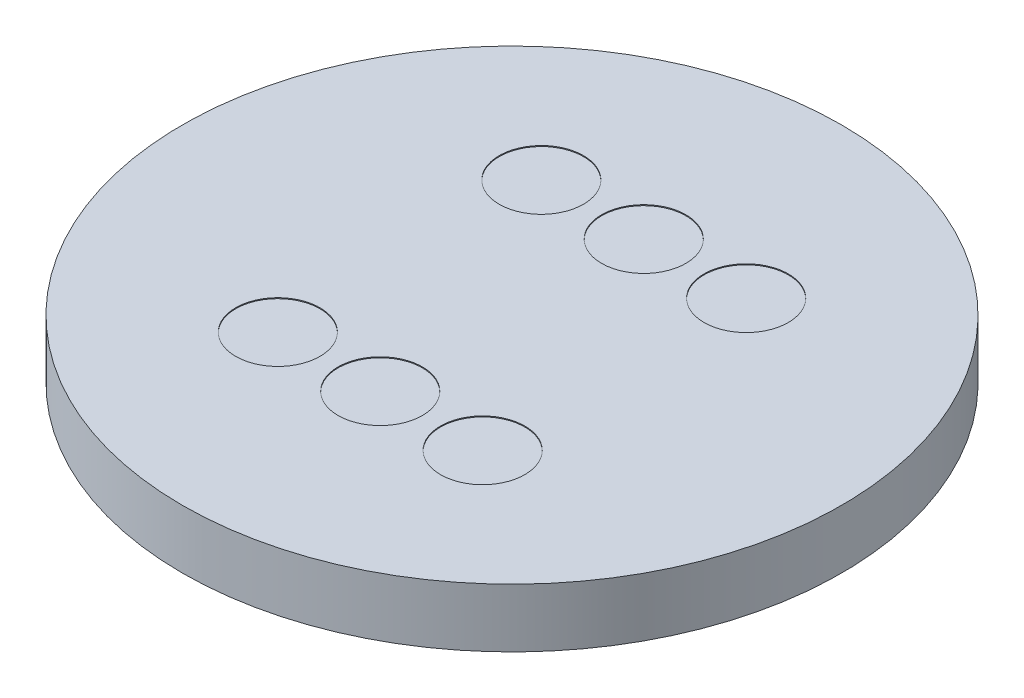
ISO-10303-21;
HEADER;
FILE_DESCRIPTION(('STEP AP214'),'2;1');
FILE_NAME('part.step','',(''),(''),'','','');
FILE_SCHEMA(('AUTOMOTIVE_DESIGN { 1 0 10303 214 1 1 1 1 }'));
ENDSEC;
DATA;
#1=APPLICATION_CONTEXT('core data for automotive mechanical design processes');
#2=APPLICATION_PROTOCOL_DEFINITION('international standard','automotive_design',2000,#1);
#3=PRODUCT_CONTEXT('',#1,'mechanical');
#4=PRODUCT('Part','Part','',(#3));
#5=PRODUCT_RELATED_PRODUCT_CATEGORY('part','',(#4));
#6=PRODUCT_DEFINITION_FORMATION('','',#4);
#7=PRODUCT_DEFINITION_CONTEXT('part definition',#1,'design');
#8=PRODUCT_DEFINITION('design','',#6,#7);
#9=PRODUCT_DEFINITION_SHAPE('','',#8);
#10=(LENGTH_UNIT() NAMED_UNIT(*) SI_UNIT(.MILLI.,.METRE.));
#11=(NAMED_UNIT(*) PLANE_ANGLE_UNIT() SI_UNIT($,.RADIAN.));
#12=(NAMED_UNIT(*) SI_UNIT($,.STERADIAN.) SOLID_ANGLE_UNIT());
#13=UNCERTAINTY_MEASURE_WITH_UNIT(LENGTH_MEASURE(1.E-05),#10,'distance_accuracy_value','');
#14=(GEOMETRIC_REPRESENTATION_CONTEXT(3) GLOBAL_UNCERTAINTY_ASSIGNED_CONTEXT((#13)) GLOBAL_UNIT_ASSIGNED_CONTEXT((#10,
#11,#12)) REPRESENTATION_CONTEXT('',''));
#15=CARTESIAN_POINT('',(0.,0.,0.));
#16=DIRECTION('',(0.,0.,1.));
#17=DIRECTION('',(1.,0.,0.));
#18=AXIS2_PLACEMENT_3D('',#15,#16,#17);
#19=CARTESIAN_POINT('',(0.,1.651,0.));
#20=DIRECTION('',(0.,-1.,0.));
#21=DIRECTION('',(0.,0.,-1.));
#22=AXIS2_PLACEMENT_3D('',#19,#20,#21);
#23=CYLINDRICAL_SURFACE('',#22,9.271);
#24=CARTESIAN_POINT('',(0.,1.651,0.));
#25=DIRECTION('',(0.,1.,0.));
#26=DIRECTION('',(0.,0.,1.));
#27=AXIS2_PLACEMENT_3D('',#24,#25,#26);
#28=CIRCLE('',#27,9.271);
#29=CARTESIAN_POINT('',(0.,1.651,-9.271));
#30=VERTEX_POINT('',#29);
#31=EDGE_CURVE('E11',#30,#30,#28,.T.);
#32=CARTESIAN_POINT('',(0.,0.,0.));
#33=DIRECTION('',(0.,1.,0.));
#34=DIRECTION('',(0.,0.,1.));
#35=AXIS2_PLACEMENT_3D('',#32,#33,#34);
#36=CIRCLE('',#35,9.271);
#37=CARTESIAN_POINT('',(0.,0.,-9.271));
#38=VERTEX_POINT('',#37);
#39=EDGE_CURVE('E57',#38,#38,#36,.T.);
#40=CARTESIAN_POINT('',(0.,1.651,-9.271));
#41=CARTESIAN_POINT('',(0.,1.63380208333333,-9.271));
#42=CARTESIAN_POINT('',(0.,1.61660416666667,-9.271));
#43=CARTESIAN_POINT('',(0.,1.58220833333333,-9.271));
#44=CARTESIAN_POINT('',(0.,1.56501041666667,-9.271));
#45=CARTESIAN_POINT('',(0.,1.53061458333333,-9.271));
#46=CARTESIAN_POINT('',(0.,1.51341666666667,-9.271));
#47=CARTESIAN_POINT('',(0.,1.47902083333333,-9.271));
#48=CARTESIAN_POINT('',(0.,1.46182291666667,-9.271));
#49=CARTESIAN_POINT('',(0.,1.42742708333333,-9.271));
#50=CARTESIAN_POINT('',(0.,1.41022916666667,-9.271));
#51=CARTESIAN_POINT('',(0.,1.37583333333333,-9.271));
#52=CARTESIAN_POINT('',(0.,1.35863541666667,-9.271));
#53=CARTESIAN_POINT('',(0.,1.32423958333333,-9.271));
#54=CARTESIAN_POINT('',(0.,1.30704166666667,-9.271));
#55=CARTESIAN_POINT('',(0.,1.27264583333333,-9.271));
#56=CARTESIAN_POINT('',(0.,1.25544791666667,-9.271));
#57=CARTESIAN_POINT('',(0.,1.22105208333333,-9.271));
#58=CARTESIAN_POINT('',(0.,1.20385416666667,-9.271));
#59=CARTESIAN_POINT('',(0.,1.16945833333333,-9.271));
#60=CARTESIAN_POINT('',(0.,1.15226041666667,-9.271));
#61=CARTESIAN_POINT('',(0.,1.11786458333333,-9.271));
#62=CARTESIAN_POINT('',(0.,1.10066666666667,-9.271));
#63=CARTESIAN_POINT('',(0.,1.06627083333333,-9.271));
#64=CARTESIAN_POINT('',(0.,1.04907291666667,-9.271));
#65=CARTESIAN_POINT('',(0.,1.01467708333333,-9.271));
#66=CARTESIAN_POINT('',(0.,0.997479166666666,-9.271));
#67=CARTESIAN_POINT('',(0.,0.963083333333333,-9.271));
#68=CARTESIAN_POINT('',(0.,0.945885416666666,-9.271));
#69=CARTESIAN_POINT('',(0.,0.911489583333333,-9.271));
#70=CARTESIAN_POINT('',(0.,0.894291666666666,-9.271));
#71=CARTESIAN_POINT('',(0.,0.859895833333333,-9.271));
#72=CARTESIAN_POINT('',(0.,0.842697916666666,-9.271));
#73=CARTESIAN_POINT('',(0.,0.808302083333333,-9.271));
#74=CARTESIAN_POINT('',(0.,0.791104166666666,-9.271));
#75=CARTESIAN_POINT('',(0.,0.756708333333333,-9.271));
#76=CARTESIAN_POINT('',(0.,0.739510416666667,-9.271));
#77=CARTESIAN_POINT('',(0.,0.705114583333333,-9.271));
#78=CARTESIAN_POINT('',(0.,0.687916666666667,-9.271));
#79=CARTESIAN_POINT('',(0.,0.653520833333333,-9.271));
#80=CARTESIAN_POINT('',(0.,0.636322916666667,-9.271));
#81=CARTESIAN_POINT('',(0.,0.601927083333333,-9.271));
#82=CARTESIAN_POINT('',(0.,0.584729166666667,-9.271));
#83=CARTESIAN_POINT('',(0.,0.550333333333333,-9.271));
#84=CARTESIAN_POINT('',(0.,0.533135416666667,-9.271));
#85=CARTESIAN_POINT('',(0.,0.498739583333333,-9.271));
#86=CARTESIAN_POINT('',(0.,0.481541666666667,-9.271));
#87=CARTESIAN_POINT('',(0.,0.447145833333333,-9.271));
#88=CARTESIAN_POINT('',(0.,0.429947916666667,-9.271));
#89=CARTESIAN_POINT('',(0.,0.395552083333333,-9.271));
#90=CARTESIAN_POINT('',(0.,0.378354166666667,-9.271));
#91=CARTESIAN_POINT('',(0.,0.343958333333333,-9.271));
#92=CARTESIAN_POINT('',(0.,0.326760416666667,-9.271));
#93=CARTESIAN_POINT('',(0.,0.292364583333333,-9.271));
#94=CARTESIAN_POINT('',(0.,0.275166666666667,-9.271));
#95=CARTESIAN_POINT('',(0.,0.240770833333333,-9.271));
#96=CARTESIAN_POINT('',(0.,0.223572916666667,-9.271));
#97=CARTESIAN_POINT('',(0.,0.189177083333333,-9.271));
#98=CARTESIAN_POINT('',(0.,0.171979166666667,-9.271));
#99=CARTESIAN_POINT('',(0.,0.137583333333333,-9.271));
#100=CARTESIAN_POINT('',(0.,0.120385416666667,-9.271));
#101=CARTESIAN_POINT('',(0.,0.0859895833333333,-9.271));
#102=CARTESIAN_POINT('',(0.,0.0687916666666667,-9.271));
#103=CARTESIAN_POINT('',(0.,0.0343958333333333,-9.271));
#104=CARTESIAN_POINT('',(0.,0.0171979166666666,-9.271));
#105=CARTESIAN_POINT('',(0.,0.,-9.271));
#106=B_SPLINE_CURVE_WITH_KNOTS('',3,(#40,#41,#42,#43,#44,#45,#46,#47,#48,#49,#50,#51,#52,#53,
#54,#55,#56,#57,#58,#59,#60,#61,#62,#63,#64,#65,#66,#67,#68,#69,#70,#71,#72,#73,#74,#75,#76,#77,
#78,#79,#80,#81,#82,#83,#84,#85,#86,#87,#88,#89,#90,#91,#92,#93,#94,#95,#96,#97,#98,#99,#100,
#101,#102,#103,#104,#105),.UNSPECIFIED.,.F.,.F.,(4,2,2,2,2,2,2,2,2,2,2,2,2,2,2,2,2,2,2,2,2,2,2,
2,2,2,2,2,2,2,2,2,4),(0.,0.0515937500000002,0.1031875,0.15478125,0.206375,0.25796875,0.3095625,
0.36115625,0.41275,0.46434375,0.5159375,0.56753125,0.619125,0.67071875,0.7223125,0.77390625,
0.8255,0.87709375,0.9286875,0.98028125,1.031875,1.08346875,1.1350625,1.18665625,1.23825,
1.28984375,1.3414375,1.39303125,1.444625,1.49621875,1.5478125,1.59940625,1.651),.UNSPECIFIED.);
#107=EDGE_CURVE('BSEAM54',#30,#38,#106,.T.);
#108=ORIENTED_EDGE('',*,*,#31,.F.);
#109=ORIENTED_EDGE('',*,*,#39,.T.);
#110=ORIENTED_EDGE('',*,*,#107,.T.);
#111=ORIENTED_EDGE('',*,*,#107,.F.);
#112=EDGE_LOOP('',(#108,#110,#109,#111));
#113=FACE_BOUND('',#112,.T.);
#114=ADVANCED_FACE('F54',(#113),#23,.T.);
#115=CARTESIAN_POINT('',(0.,1.651,0.));
#116=DIRECTION('',(0.,1.,0.));
#117=DIRECTION('',(0.,0.,1.));
#118=AXIS2_PLACEMENT_3D('',#115,#116,#117);
#119=PLANE('',#118);
#120=CARTESIAN_POINT('',(0.,1.651,-3.70636063912855));
#121=DIRECTION('',(0.,1.,0.));
#122=DIRECTION('',(0.,0.,1.));
#123=AXIS2_PLACEMENT_3D('',#120,#121,#122);
#124=CIRCLE('',#123,1.18601071502411);
#125=CARTESIAN_POINT('',(0.,1.651,-2.52034992410444));
#126=VERTEX_POINT('',#125);
#127=EDGE_CURVE('E112',#126,#126,#124,.T.);
#128=ORIENTED_EDGE('',*,*,#127,.F.);
#129=EDGE_LOOP('',(#128));
#130=FACE_BOUND('',#129,.T.);
#131=CARTESIAN_POINT('',(2.88114027003417,1.651,-3.70636063912855));
#132=DIRECTION('',(0.,1.,0.));
#133=DIRECTION('',(0.,0.,1.));
#134=AXIS2_PLACEMENT_3D('',#131,#132,#133);
#135=CIRCLE('',#134,1.18601071502411);
#136=CARTESIAN_POINT('',(2.88114027003417,1.651,-2.52034992410444));
#137=VERTEX_POINT('',#136);
#138=EDGE_CURVE('E137',#137,#137,#135,.T.);
#139=ORIENTED_EDGE('',*,*,#138,.F.);
#140=EDGE_LOOP('',(#139));
#141=FACE_BOUND('',#140,.T.);
#142=CARTESIAN_POINT('',(0.,1.651,3.70636063912855));
#143=DIRECTION('',(0.,1.,0.));
#144=DIRECTION('',(0.,0.,1.));
#145=AXIS2_PLACEMENT_3D('',#142,#143,#144);
#146=CIRCLE('',#145,1.18601071502411);
#147=CARTESIAN_POINT('',(0.,1.651,4.89237135415266));
#148=VERTEX_POINT('',#147);
#149=EDGE_CURVE('E129',#148,#148,#146,.T.);
#150=ORIENTED_EDGE('',*,*,#149,.F.);
#151=EDGE_LOOP('',(#150));
#152=FACE_BOUND('',#151,.T.);
#153=CARTESIAN_POINT('',(-2.88114027003417,1.651,3.70636063912855));
#154=DIRECTION('',(0.,1.,0.));
#155=DIRECTION('',(0.,0.,1.));
#156=AXIS2_PLACEMENT_3D('',#153,#154,#155);
#157=CIRCLE('',#156,1.18601071502411);
#158=CARTESIAN_POINT('',(-2.88114027003417,1.651,4.89237135415266));
#159=VERTEX_POINT('',#158);
#160=EDGE_CURVE('E120',#159,#159,#157,.T.);
#161=ORIENTED_EDGE('',*,*,#160,.F.);
#162=EDGE_LOOP('',(#161));
#163=FACE_BOUND('',#162,.T.);
#164=CARTESIAN_POINT('',(2.88114027003417,1.651,3.70636063912855));
#165=DIRECTION('',(0.,1.,0.));
#166=DIRECTION('',(0.,0.,1.));
#167=AXIS2_PLACEMENT_3D('',#164,#165,#166);
#168=CIRCLE('',#167,1.18601071502411);
#169=CARTESIAN_POINT('',(2.88114027003417,1.651,4.89237135415266));
#170=VERTEX_POINT('',#169);
#171=EDGE_CURVE('E121',#170,#170,#168,.T.);
#172=ORIENTED_EDGE('',*,*,#171,.F.);
#173=EDGE_LOOP('',(#172));
#174=FACE_BOUND('',#173,.T.);
#175=CARTESIAN_POINT('',(-2.88114027003417,1.651,-3.70636063912855));
#176=DIRECTION('',(0.,1.,0.));
#177=DIRECTION('',(0.,0.,1.));
#178=AXIS2_PLACEMENT_3D('',#175,#176,#177);
#179=CIRCLE('',#178,1.18601071502411);
#180=CARTESIAN_POINT('',(-2.88114027003417,1.651,-2.52034992410444));
#181=VERTEX_POINT('',#180);
#182=EDGE_CURVE('E108',#181,#181,#179,.T.);
#183=ORIENTED_EDGE('',*,*,#182,.F.);
#184=EDGE_LOOP('',(#183));
#185=FACE_BOUND('',#184,.T.);
#186=ORIENTED_EDGE('',*,*,#31,.T.);
#187=EDGE_LOOP('',(#186));
#188=FACE_BOUND('',#187,.T.);
#189=ADVANCED_FACE('F158',(#130,#141,#152,#163,#174,#185,#188),#119,.T.);
#190=CARTESIAN_POINT('',(0.,0.,0.));
#191=DIRECTION('',(0.,1.,0.));
#192=DIRECTION('',(0.,0.,1.));
#193=AXIS2_PLACEMENT_3D('',#190,#191,#192);
#194=PLANE('',#193);
#195=CARTESIAN_POINT('',(0.,0.,0.));
#196=DIRECTION('',(0.,1.,0.));
#197=DIRECTION('',(0.,0.,1.));
#198=AXIS2_PLACEMENT_3D('',#195,#196,#197);
#199=CIRCLE('',#198,7.874);
#200=CARTESIAN_POINT('',(0.,0.,7.874));
#201=VERTEX_POINT('',#200);
#202=EDGE_CURVE('E68',#201,#201,#199,.T.);
#203=ORIENTED_EDGE('',*,*,#202,.T.);
#204=EDGE_LOOP('',(#203));
#205=FACE_BOUND('',#204,.T.);
#206=ORIENTED_EDGE('',*,*,#39,.F.);
#207=EDGE_LOOP('',(#206));
#208=FACE_BOUND('',#207,.T.);
#209=ADVANCED_FACE('F161',(#205,#208),#194,.F.);
#210=CARTESIAN_POINT('',(0.,0.0254,0.));
#211=DIRECTION('',(0.,-1.,0.));
#212=DIRECTION('',(0.,0.,-1.));
#213=AXIS2_PLACEMENT_3D('',#210,#211,#212);
#214=CYLINDRICAL_SURFACE('',#213,5.1435);
#215=CARTESIAN_POINT('',(0.,0.0254,0.));
#216=DIRECTION('',(0.,1.,0.));
#217=DIRECTION('',(0.,0.,1.));
#218=AXIS2_PLACEMENT_3D('',#215,#216,#217);
#219=CIRCLE('',#218,5.1435);
#220=CARTESIAN_POINT('',(0.,0.0254,5.1435));
#221=VERTEX_POINT('',#220);
#222=EDGE_CURVE('E72',#221,#221,#219,.T.);
#223=ORIENTED_EDGE('',*,*,#222,.F.);
#224=EDGE_LOOP('',(#223));
#225=FACE_BOUND('',#224,.T.);
#226=CARTESIAN_POINT('',(0.,0.,0.));
#227=DIRECTION('',(0.,1.,0.));
#228=DIRECTION('',(0.,0.,1.));
#229=AXIS2_PLACEMENT_3D('',#226,#227,#228);
#230=CIRCLE('',#229,5.1435);
#231=CARTESIAN_POINT('',(0.,0.,5.1435));
#232=VERTEX_POINT('',#231);
#233=EDGE_CURVE('E73',#232,#232,#230,.T.);
#234=ORIENTED_EDGE('',*,*,#233,.T.);
#235=EDGE_LOOP('',(#234));
#236=FACE_BOUND('',#235,.T.);
#237=ADVANCED_FACE('F191',(#225,#236),#214,.T.);
#238=CARTESIAN_POINT('',(0.,0.0254,0.));
#239=DIRECTION('',(0.,-1.,0.));
#240=DIRECTION('',(0.,0.,-1.));
#241=AXIS2_PLACEMENT_3D('',#238,#239,#240);
#242=CYLINDRICAL_SURFACE('',#241,7.874);
#243=CARTESIAN_POINT('',(0.,0.0254,0.));
#244=DIRECTION('',(0.,1.,0.));
#245=DIRECTION('',(0.,0.,1.));
#246=AXIS2_PLACEMENT_3D('',#243,#244,#245);
#247=CIRCLE('',#246,7.874);
#248=CARTESIAN_POINT('',(0.,0.0254,7.874));
#249=VERTEX_POINT('',#248);
#250=EDGE_CURVE('E66',#249,#249,#247,.T.);
#251=ORIENTED_EDGE('',*,*,#250,.T.);
#252=EDGE_LOOP('',(#251));
#253=FACE_BOUND('',#252,.T.);
#254=ORIENTED_EDGE('',*,*,#202,.F.);
#255=EDGE_LOOP('',(#254));
#256=FACE_BOUND('',#255,.T.);
#257=ADVANCED_FACE('F198',(#253,#256),#242,.F.);
#258=CARTESIAN_POINT('',(0.,0.0254,0.));
#259=DIRECTION('',(0.,1.,0.));
#260=DIRECTION('',(0.,0.,1.));
#261=AXIS2_PLACEMENT_3D('',#258,#259,#260);
#262=PLANE('',#261);
#263=ORIENTED_EDGE('',*,*,#222,.T.);
#264=EDGE_LOOP('',(#263));
#265=FACE_BOUND('',#264,.T.);
#266=ORIENTED_EDGE('',*,*,#250,.F.);
#267=EDGE_LOOP('',(#266));
#268=FACE_BOUND('',#267,.T.);
#269=ADVANCED_FACE('F206',(#265,#268),#262,.F.);
#270=CARTESIAN_POINT('',(0.,0.,0.));
#271=DIRECTION('',(0.,1.,0.));
#272=DIRECTION('',(0.,0.,1.));
#273=AXIS2_PLACEMENT_3D('',#270,#271,#272);
#274=CIRCLE('',#273,4.826);
#275=CARTESIAN_POINT('',(0.,0.,4.826));
#276=VERTEX_POINT('',#275);
#277=EDGE_CURVE('E84',#276,#276,#274,.T.);
#278=ORIENTED_EDGE('',*,*,#277,.T.);
#279=EDGE_LOOP('',(#278));
#280=FACE_BOUND('',#279,.T.);
#281=ORIENTED_EDGE('',*,*,#233,.F.);
#282=EDGE_LOOP('',(#281));
#283=FACE_BOUND('',#282,.T.);
#284=ADVANCED_FACE('F194',(#280,#283),#194,.F.);
#285=CARTESIAN_POINT('',(0.,0.0254,0.));
#286=DIRECTION('',(0.,-1.,0.));
#287=DIRECTION('',(0.,0.,-1.));
#288=AXIS2_PLACEMENT_3D('',#285,#286,#287);
#289=CYLINDRICAL_SURFACE('',#288,2.159);
#290=CARTESIAN_POINT('',(0.,0.0254,0.));
#291=DIRECTION('',(0.,1.,0.));
#292=DIRECTION('',(0.,0.,1.));
#293=AXIS2_PLACEMENT_3D('',#290,#291,#292);
#294=CIRCLE('',#293,2.159);
#295=CARTESIAN_POINT('',(0.,0.0254,2.159));
#296=VERTEX_POINT('',#295);
#297=EDGE_CURVE('E88',#296,#296,#294,.T.);
#298=ORIENTED_EDGE('',*,*,#297,.F.);
#299=EDGE_LOOP('',(#298));
#300=FACE_BOUND('',#299,.T.);
#301=CARTESIAN_POINT('',(0.,0.,0.));
#302=DIRECTION('',(0.,1.,0.));
#303=DIRECTION('',(0.,0.,1.));
#304=AXIS2_PLACEMENT_3D('',#301,#302,#303);
#305=CIRCLE('',#304,2.159);
#306=CARTESIAN_POINT('',(0.,0.,2.159));
#307=VERTEX_POINT('',#306);
#308=EDGE_CURVE('E89',#307,#307,#305,.T.);
#309=ORIENTED_EDGE('',*,*,#308,.T.);
#310=EDGE_LOOP('',(#309));
#311=FACE_BOUND('',#310,.T.);
#312=ADVANCED_FACE('F205',(#300,#311),#289,.T.);
#313=CARTESIAN_POINT('',(0.,0.0254,0.));
#314=DIRECTION('',(0.,-1.,0.));
#315=DIRECTION('',(0.,0.,-1.));
#316=AXIS2_PLACEMENT_3D('',#313,#314,#315);
#317=CYLINDRICAL_SURFACE('',#316,4.826);
#318=CARTESIAN_POINT('',(0.,0.0254,0.));
#319=DIRECTION('',(0.,1.,0.));
#320=DIRECTION('',(0.,0.,1.));
#321=AXIS2_PLACEMENT_3D('',#318,#319,#320);
#322=CIRCLE('',#321,4.826);
#323=CARTESIAN_POINT('',(0.,0.0254,4.826));
#324=VERTEX_POINT('',#323);
#325=EDGE_CURVE('E77',#324,#324,#322,.T.);
#326=ORIENTED_EDGE('',*,*,#325,.T.);
#327=EDGE_LOOP('',(#326));
#328=FACE_BOUND('',#327,.T.);
#329=ORIENTED_EDGE('',*,*,#277,.F.);
#330=EDGE_LOOP('',(#329));
#331=FACE_BOUND('',#330,.T.);
#332=ADVANCED_FACE('F212',(#328,#331),#317,.F.);
#333=CARTESIAN_POINT('',(0.,0.0254,0.));
#334=DIRECTION('',(0.,1.,0.));
#335=DIRECTION('',(0.,0.,1.));
#336=AXIS2_PLACEMENT_3D('',#333,#334,#335);
#337=PLANE('',#336);
#338=ORIENTED_EDGE('',*,*,#297,.T.);
#339=EDGE_LOOP('',(#338));
#340=FACE_BOUND('',#339,.T.);
#341=ORIENTED_EDGE('',*,*,#325,.F.);
#342=EDGE_LOOP('',(#341));
#343=FACE_BOUND('',#342,.T.);
#344=ADVANCED_FACE('F202',(#340,#343),#337,.F.);
#345=CARTESIAN_POINT('',(0.,0.,0.));
#346=DIRECTION('',(0.,1.,0.));
#347=DIRECTION('',(0.,0.,1.));
#348=AXIS2_PLACEMENT_3D('',#345,#346,#347);
#349=CIRCLE('',#348,1.905);
#350=CARTESIAN_POINT('',(0.,0.,1.905));
#351=VERTEX_POINT('',#350);
#352=EDGE_CURVE('E100',#351,#351,#349,.T.);
#353=ORIENTED_EDGE('',*,*,#352,.T.);
#354=EDGE_LOOP('',(#353));
#355=FACE_BOUND('',#354,.T.);
#356=ORIENTED_EDGE('',*,*,#308,.F.);
#357=EDGE_LOOP('',(#356));
#358=FACE_BOUND('',#357,.T.);
#359=ADVANCED_FACE('F193',(#355,#358),#194,.F.);
#360=CARTESIAN_POINT('',(0.,0.0254,0.));
#361=DIRECTION('',(0.,-1.,0.));
#362=DIRECTION('',(0.,0.,-1.));
#363=AXIS2_PLACEMENT_3D('',#360,#361,#362);
#364=CYLINDRICAL_SURFACE('',#363,1.905);
#365=CARTESIAN_POINT('',(0.,0.0254,0.));
#366=DIRECTION('',(0.,1.,0.));
#367=DIRECTION('',(0.,0.,1.));
#368=AXIS2_PLACEMENT_3D('',#365,#366,#367);
#369=CIRCLE('',#368,1.905);
#370=CARTESIAN_POINT('',(0.,0.0254,1.905));
#371=VERTEX_POINT('',#370);
#372=EDGE_CURVE('E93',#371,#371,#369,.T.);
#373=ORIENTED_EDGE('',*,*,#372,.T.);
#374=EDGE_LOOP('',(#373));
#375=FACE_BOUND('',#374,.T.);
#376=ORIENTED_EDGE('',*,*,#352,.F.);
#377=EDGE_LOOP('',(#376));
#378=FACE_BOUND('',#377,.T.);
#379=ADVANCED_FACE('F178',(#375,#378),#364,.F.);
#380=CARTESIAN_POINT('',(0.,0.0254,0.));
#381=DIRECTION('',(0.,1.,0.));
#382=DIRECTION('',(0.,0.,1.));
#383=AXIS2_PLACEMENT_3D('',#380,#381,#382);
#384=PLANE('',#383);
#385=ORIENTED_EDGE('',*,*,#372,.F.);
#386=EDGE_LOOP('',(#385));
#387=FACE_BOUND('',#386,.T.);
#388=ADVANCED_FACE('F169',(#387),#384,.F.);
#389=CARTESIAN_POINT('',(-2.88114027003417,1.6256,-3.70636063912855));
#390=DIRECTION('',(0.,1.,0.));
#391=DIRECTION('',(0.,0.,1.));
#392=AXIS2_PLACEMENT_3D('',#389,#390,#391);
#393=CYLINDRICAL_SURFACE('',#392,1.18601071502411);
#394=CARTESIAN_POINT('',(-2.88114027003417,1.6256,-3.70636063912855));
#395=DIRECTION('',(0.,1.,0.));
#396=DIRECTION('',(0.,0.,1.));
#397=AXIS2_PLACEMENT_3D('',#394,#395,#396);
#398=CIRCLE('',#397,1.18601071502411);
#399=CARTESIAN_POINT('',(-2.88114027003417,1.6256,-2.52034992410444));
#400=VERTEX_POINT('',#399);
#401=EDGE_CURVE('E104',#400,#400,#398,.T.);
#402=ORIENTED_EDGE('',*,*,#401,.F.);
#403=EDGE_LOOP('',(#402));
#404=FACE_BOUND('',#403,.T.);
#405=ORIENTED_EDGE('',*,*,#182,.T.);
#406=EDGE_LOOP('',(#405));
#407=FACE_BOUND('',#406,.T.);
#408=ADVANCED_FACE('F166',(#404,#407),#393,.F.);
#409=CARTESIAN_POINT('',(0.,1.6256,0.));
#410=DIRECTION('',(0.,1.,0.));
#411=DIRECTION('',(0.,0.,1.));
#412=AXIS2_PLACEMENT_3D('',#409,#410,#411);
#413=PLANE('',#412);
#414=ORIENTED_EDGE('',*,*,#401,.T.);
#415=EDGE_LOOP('',(#414));
#416=FACE_BOUND('',#415,.T.);
#417=ADVANCED_FACE('F168',(#416),#413,.T.);
#418=CARTESIAN_POINT('',(2.88114027003417,1.6256,3.70636063912855));
#419=DIRECTION('',(0.,1.,0.));
#420=DIRECTION('',(0.,0.,1.));
#421=AXIS2_PLACEMENT_3D('',#418,#419,#420);
#422=CYLINDRICAL_SURFACE('',#421,1.18601071502411);
#423=CARTESIAN_POINT('',(2.88114027003417,1.6256,3.70636063912855));
#424=DIRECTION('',(0.,1.,0.));
#425=DIRECTION('',(0.,0.,1.));
#426=AXIS2_PLACEMENT_3D('',#423,#424,#425);
#427=CIRCLE('',#426,1.18601071502411);
#428=CARTESIAN_POINT('',(2.88114027003417,1.6256,4.89237135415266));
#429=VERTEX_POINT('',#428);
#430=EDGE_CURVE('E148',#429,#429,#427,.T.);
#431=ORIENTED_EDGE('',*,*,#430,.F.);
#432=EDGE_LOOP('',(#431));
#433=FACE_BOUND('',#432,.T.);
#434=ORIENTED_EDGE('',*,*,#171,.T.);
#435=EDGE_LOOP('',(#434));
#436=FACE_BOUND('',#435,.T.);
#437=ADVANCED_FACE('F156',(#433,#436),#422,.F.);
#438=CARTESIAN_POINT('',(2.88114027003417,1.6256,3.70636063912855));
#439=DIRECTION('',(0.,1.,0.));
#440=DIRECTION('',(0.,0.,1.));
#441=AXIS2_PLACEMENT_3D('',#438,#439,#440);
#442=PLANE('',#441);
#443=ORIENTED_EDGE('',*,*,#430,.T.);
#444=EDGE_LOOP('',(#443));
#445=FACE_BOUND('',#444,.T.);
#446=ADVANCED_FACE('F310',(#445),#442,.T.);
#447=CARTESIAN_POINT('',(-2.88114027003417,1.6256,3.70636063912855));
#448=DIRECTION('',(0.,1.,0.));
#449=DIRECTION('',(0.,0.,1.));
#450=AXIS2_PLACEMENT_3D('',#447,#448,#449);
#451=CYLINDRICAL_SURFACE('',#450,1.18601071502411);
#452=CARTESIAN_POINT('',(-2.88114027003417,1.6256,3.70636063912855));
#453=DIRECTION('',(0.,1.,0.));
#454=DIRECTION('',(0.,0.,1.));
#455=AXIS2_PLACEMENT_3D('',#452,#453,#454);
#456=CIRCLE('',#455,1.18601071502411);
#457=CARTESIAN_POINT('',(-2.88114027003417,1.6256,4.89237135415266));
#458=VERTEX_POINT('',#457);
#459=EDGE_CURVE('E116',#458,#458,#456,.T.);
#460=ORIENTED_EDGE('',*,*,#459,.F.);
#461=EDGE_LOOP('',(#460));
#462=FACE_BOUND('',#461,.T.);
#463=ORIENTED_EDGE('',*,*,#160,.T.);
#464=EDGE_LOOP('',(#463));
#465=FACE_BOUND('',#464,.T.);
#466=ADVANCED_FACE('F320',(#462,#465),#451,.F.);
#467=CARTESIAN_POINT('',(0.,1.6256,0.));
#468=DIRECTION('',(0.,1.,0.));
#469=DIRECTION('',(0.,0.,1.));
#470=AXIS2_PLACEMENT_3D('',#467,#468,#469);
#471=PLANE('',#470);
#472=ORIENTED_EDGE('',*,*,#459,.T.);
#473=EDGE_LOOP('',(#472));
#474=FACE_BOUND('',#473,.T.);
#475=ADVANCED_FACE('F330',(#474),#471,.T.);
#476=CARTESIAN_POINT('',(0.,1.6256,3.70636063912855));
#477=DIRECTION('',(0.,1.,0.));
#478=DIRECTION('',(0.,0.,1.));
#479=AXIS2_PLACEMENT_3D('',#476,#477,#478);
#480=CYLINDRICAL_SURFACE('',#479,1.18601071502411);
#481=CARTESIAN_POINT('',(0.,1.6256,3.70636063912855));
#482=DIRECTION('',(0.,1.,0.));
#483=DIRECTION('',(0.,0.,1.));
#484=AXIS2_PLACEMENT_3D('',#481,#482,#483);
#485=CIRCLE('',#484,1.18601071502411);
#486=CARTESIAN_POINT('',(0.,1.6256,4.89237135415266));
#487=VERTEX_POINT('',#486);
#488=EDGE_CURVE('E125',#487,#487,#485,.T.);
#489=ORIENTED_EDGE('',*,*,#488,.F.);
#490=EDGE_LOOP('',(#489));
#491=FACE_BOUND('',#490,.T.);
#492=ORIENTED_EDGE('',*,*,#149,.T.);
#493=EDGE_LOOP('',(#492));
#494=FACE_BOUND('',#493,.T.);
#495=ADVANCED_FACE('F340',(#491,#494),#480,.F.);
#496=CARTESIAN_POINT('',(0.,1.6256,0.));
#497=DIRECTION('',(0.,1.,0.));
#498=DIRECTION('',(0.,0.,1.));
#499=AXIS2_PLACEMENT_3D('',#496,#497,#498);
#500=PLANE('',#499);
#501=ORIENTED_EDGE('',*,*,#488,.T.);
#502=EDGE_LOOP('',(#501));
#503=FACE_BOUND('',#502,.T.);
#504=ADVANCED_FACE('F350',(#503),#500,.T.);
#505=CARTESIAN_POINT('',(2.88114027003417,1.6256,-3.70636063912855));
#506=DIRECTION('',(0.,1.,0.));
#507=DIRECTION('',(0.,0.,1.));
#508=AXIS2_PLACEMENT_3D('',#505,#506,#507);
#509=CYLINDRICAL_SURFACE('',#508,1.18601071502411);
#510=CARTESIAN_POINT('',(2.88114027003417,1.6256,-3.70636063912855));
#511=DIRECTION('',(0.,1.,0.));
#512=DIRECTION('',(0.,0.,1.));
#513=AXIS2_PLACEMENT_3D('',#510,#511,#512);
#514=CIRCLE('',#513,1.18601071502411);
#515=CARTESIAN_POINT('',(2.88114027003417,1.6256,-2.52034992410444));
#516=VERTEX_POINT('',#515);
#517=EDGE_CURVE('E133',#516,#516,#514,.T.);
#518=ORIENTED_EDGE('',*,*,#517,.F.);
#519=EDGE_LOOP('',(#518));
#520=FACE_BOUND('',#519,.T.);
#521=ORIENTED_EDGE('',*,*,#138,.T.);
#522=EDGE_LOOP('',(#521));
#523=FACE_BOUND('',#522,.T.);
#524=ADVANCED_FACE('F360',(#520,#523),#509,.F.);
#525=CARTESIAN_POINT('',(0.,1.6256,0.));
#526=DIRECTION('',(0.,1.,0.));
#527=DIRECTION('',(0.,0.,1.));
#528=AXIS2_PLACEMENT_3D('',#525,#526,#527);
#529=PLANE('',#528);
#530=ORIENTED_EDGE('',*,*,#517,.T.);
#531=EDGE_LOOP('',(#530));
#532=FACE_BOUND('',#531,.T.);
#533=ADVANCED_FACE('F370',(#532),#529,.T.);
#534=CARTESIAN_POINT('',(0.,1.6256,-3.70636063912855));
#535=DIRECTION('',(0.,1.,0.));
#536=DIRECTION('',(0.,0.,1.));
#537=AXIS2_PLACEMENT_3D('',#534,#535,#536);
#538=CYLINDRICAL_SURFACE('',#537,1.18601071502411);
#539=CARTESIAN_POINT('',(0.,1.6256,-3.70636063912855));
#540=DIRECTION('',(0.,1.,0.));
#541=DIRECTION('',(0.,0.,1.));
#542=AXIS2_PLACEMENT_3D('',#539,#540,#541);
#543=CIRCLE('',#542,1.18601071502411);
#544=CARTESIAN_POINT('',(0.,1.6256,-2.52034992410444));
#545=VERTEX_POINT('',#544);
#546=EDGE_CURVE('E141',#545,#545,#543,.T.);
#547=ORIENTED_EDGE('',*,*,#546,.F.);
#548=EDGE_LOOP('',(#547));
#549=FACE_BOUND('',#548,.T.);
#550=ORIENTED_EDGE('',*,*,#127,.T.);
#551=EDGE_LOOP('',(#550));
#552=FACE_BOUND('',#551,.T.);
#553=ADVANCED_FACE('F380',(#549,#552),#538,.F.);
#554=CARTESIAN_POINT('',(0.,1.6256,0.));
#555=DIRECTION('',(0.,1.,0.));
#556=DIRECTION('',(0.,0.,1.));
#557=AXIS2_PLACEMENT_3D('',#554,#555,#556);
#558=PLANE('',#557);
#559=ORIENTED_EDGE('',*,*,#546,.T.);
#560=EDGE_LOOP('',(#559));
#561=FACE_BOUND('',#560,.T.);
#562=ADVANCED_FACE('F390',(#561),#558,.T.);
#563=CLOSED_SHELL('',(#114,#189,#209,#237,#257,#269,#284,#312,#332,#344,#359,#379,#388,#408,
#417,#437,#446,#466,#475,#495,#504,#524,#533,#553,#562));
#564=MANIFOLD_SOLID_BREP('B2',#563);
#565=ADVANCED_BREP_SHAPE_REPRESENTATION('',(#18,#564),#14);
#566=SHAPE_DEFINITION_REPRESENTATION(#9,#565);
ENDSEC;
END-ISO-10303-21;
